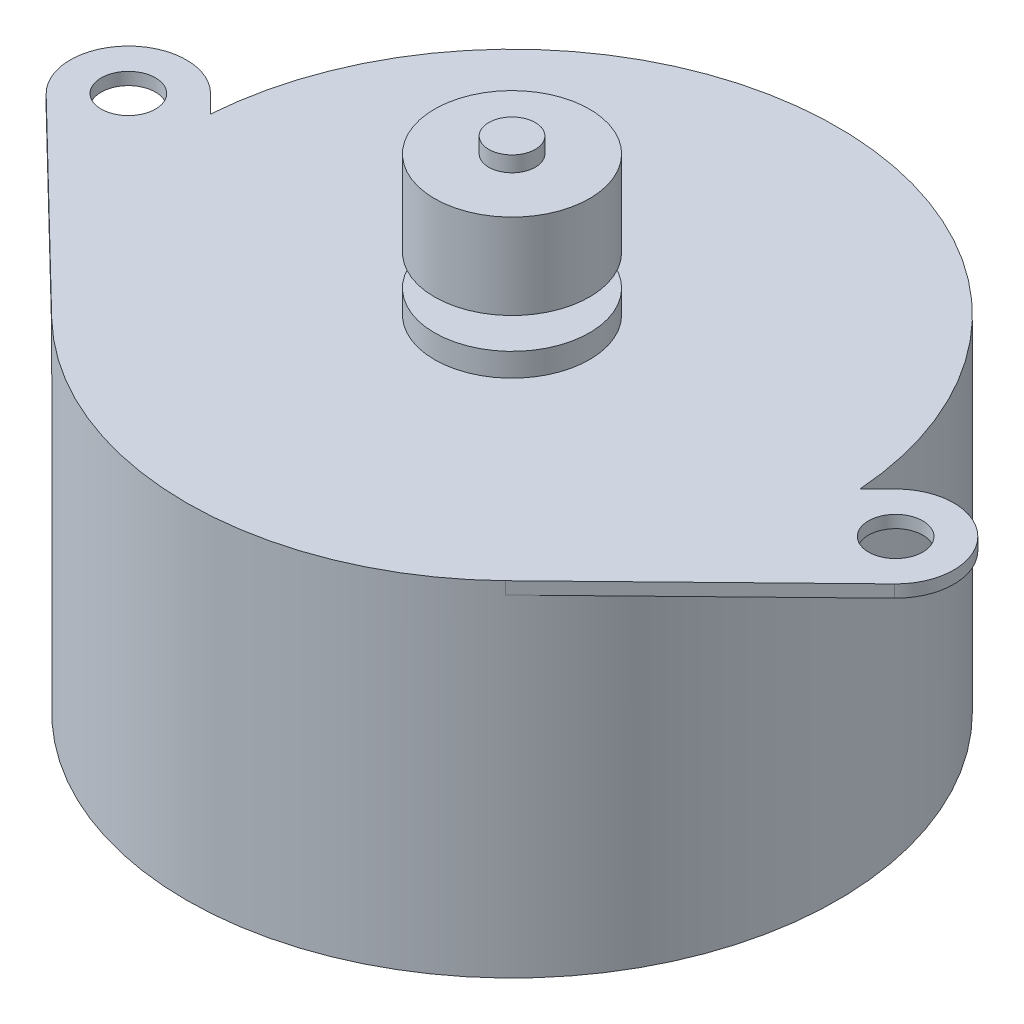
ISO-10303-21;
HEADER;
FILE_DESCRIPTION(('STEP AP214'),'2;1');
FILE_NAME('part.step','',(''),(''),'','','');
FILE_SCHEMA(('AUTOMOTIVE_DESIGN { 1 0 10303 214 1 1 1 1 }'));
ENDSEC;
DATA;
#1=APPLICATION_CONTEXT('core data for automotive mechanical design processes');
#2=APPLICATION_PROTOCOL_DEFINITION('international standard','automotive_design',2000,#1);
#3=PRODUCT_CONTEXT('',#1,'mechanical');
#4=PRODUCT('Part','Part','',(#3));
#5=PRODUCT_RELATED_PRODUCT_CATEGORY('part','',(#4));
#6=PRODUCT_DEFINITION_FORMATION('','',#4);
#7=PRODUCT_DEFINITION_CONTEXT('part definition',#1,'design');
#8=PRODUCT_DEFINITION('design','',#6,#7);
#9=PRODUCT_DEFINITION_SHAPE('','',#8);
#10=(LENGTH_UNIT() NAMED_UNIT(*) SI_UNIT(.MILLI.,.METRE.));
#11=(NAMED_UNIT(*) PLANE_ANGLE_UNIT() SI_UNIT($,.RADIAN.));
#12=(NAMED_UNIT(*) SI_UNIT($,.STERADIAN.) SOLID_ANGLE_UNIT());
#13=UNCERTAINTY_MEASURE_WITH_UNIT(LENGTH_MEASURE(1.E-05),#10,'distance_accuracy_value','');
#14=(GEOMETRIC_REPRESENTATION_CONTEXT(3) GLOBAL_UNCERTAINTY_ASSIGNED_CONTEXT((#13)) GLOBAL_UNIT_ASSIGNED_CONTEXT((#10,
#11,#12)) REPRESENTATION_CONTEXT('',''));
#15=CARTESIAN_POINT('',(0.,0.,0.));
#16=DIRECTION('',(0.,0.,1.));
#17=DIRECTION('',(1.,0.,0.));
#18=AXIS2_PLACEMENT_3D('',#15,#16,#17);
#19=CARTESIAN_POINT('',(0.,32.2,0.));
#20=DIRECTION('',(0.,-1.,0.));
#21=DIRECTION('',(0.,0.,-1.));
#22=AXIS2_PLACEMENT_3D('',#19,#20,#21);
#23=CYLINDRICAL_SURFACE('',#22,1.5);
#24=CARTESIAN_POINT('',(0.,23.7,0.));
#25=DIRECTION('',(0.,1.,0.));
#26=DIRECTION('',(0.,0.,1.));
#27=AXIS2_PLACEMENT_3D('',#24,#25,#26);
#28=CIRCLE('',#27,1.5);
#29=CARTESIAN_POINT('',(0.,23.7,1.5));
#30=VERTEX_POINT('',#29);
#31=EDGE_CURVE('E134',#30,#30,#28,.T.);
#32=ORIENTED_EDGE('',*,*,#31,.T.);
#33=EDGE_LOOP('',(#32));
#34=FACE_BOUND('',#33,.T.);
#35=CARTESIAN_POINT('',(0.,25.7,0.));
#36=DIRECTION('',(0.,1.,0.));
#37=DIRECTION('',(0.,0.,1.));
#38=AXIS2_PLACEMENT_3D('',#35,#36,#37);
#39=CIRCLE('',#38,1.5);
#40=CARTESIAN_POINT('',(0.,25.7,1.5));
#41=VERTEX_POINT('',#40);
#42=EDGE_CURVE('E43',#41,#41,#39,.T.);
#43=ORIENTED_EDGE('',*,*,#42,.F.);
#44=EDGE_LOOP('',(#43));
#45=FACE_BOUND('',#44,.T.);
#46=ADVANCED_FACE('F35',(#34,#45),#23,.T.);
#47=CARTESIAN_POINT('',(0.,21.4,0.));
#48=DIRECTION('',(0.,-1.,0.));
#49=DIRECTION('',(0.,0.,-1.));
#50=AXIS2_PLACEMENT_3D('',#47,#48,#49);
#51=CYLINDRICAL_SURFACE('',#50,21.);
#52=CARTESIAN_POINT('',(0.,21.4,0.));
#53=DIRECTION('',(0.,1.,0.));
#54=DIRECTION('',(0.,0.,1.));
#55=AXIS2_PLACEMENT_3D('',#52,#53,#54);
#56=CIRCLE('',#55,21.);
#57=CARTESIAN_POINT('',(14.6353031626223,21.4,15.0601428060316));
#58=VERTEX_POINT('',#57);
#59=CARTESIAN_POINT('',(20.946382722661,21.4,-1.49968357856137));
#60=VERTEX_POINT('',#59);
#61=EDGE_CURVE('E133',#58,#60,#56,.T.);
#62=ORIENTED_EDGE('',*,*,#61,.F.);
#63=DIRECTION('',(0.,-1.,0.));
#64=VECTOR('',#63,1.);
#65=CARTESIAN_POINT('',(14.6353031626223,22.2,15.0601428060316));
#66=LINE('',#65,#64);
#67=CARTESIAN_POINT('',(14.6353031626223,22.2,15.0601428060316));
#68=VERTEX_POINT('',#67);
#69=EDGE_CURVE('E129',#68,#58,#66,.T.);
#70=ORIENTED_EDGE('',*,*,#69,.F.);
#71=CARTESIAN_POINT('',(0.,22.2,0.));
#72=DIRECTION('',(0.,1.,0.));
#73=DIRECTION('',(0.,0.,1.));
#74=AXIS2_PLACEMENT_3D('',#71,#72,#73);
#75=CIRCLE('',#74,20.9999999999983);
#76=CARTESIAN_POINT('',(-14.6348726808142,22.2,15.0605611321851));
#77=VERTEX_POINT('',#76);
#78=EDGE_CURVE('E109',#77,#68,#75,.T.);
#79=ORIENTED_EDGE('',*,*,#78,.F.);
#80=DIRECTION('',(0.,-1.,0.));
#81=VECTOR('',#80,1.);
#82=CARTESIAN_POINT('',(-14.6348726808142,22.2,15.0605611321851));
#83=LINE('',#82,#81);
#84=CARTESIAN_POINT('',(-14.6348726808142,21.4,15.0605611321851));
#85=VERTEX_POINT('',#84);
#86=EDGE_CURVE('E106',#77,#85,#83,.T.);
#87=ORIENTED_EDGE('',*,*,#86,.T.);
#88=CARTESIAN_POINT('',(-20.9463827224607,21.4,-1.49968358135981));
#89=VERTEX_POINT('',#88);
#90=EDGE_CURVE('E50',#89,#85,#56,.T.);
#91=ORIENTED_EDGE('',*,*,#90,.F.);
#92=DIRECTION('',(0.,-1.,0.));
#93=VECTOR('',#92,1.);
#94=CARTESIAN_POINT('',(-20.9463827224591,22.2,-1.49968358135819));
#95=LINE('',#94,#93);
#96=CARTESIAN_POINT('',(-20.9463827224591,22.2,-1.49968358135819));
#97=VERTEX_POINT('',#96);
#98=EDGE_CURVE('E187',#97,#89,#95,.T.);
#99=ORIENTED_EDGE('',*,*,#98,.F.);
#100=CARTESIAN_POINT('',(0.,22.2,0.));
#101=DIRECTION('',(0.,1.,0.));
#102=DIRECTION('',(0.,0.,1.));
#103=AXIS2_PLACEMENT_3D('',#100,#101,#102);
#104=CIRCLE('',#103,20.9999999999983);
#105=CARTESIAN_POINT('',(20.9463827226594,22.2,-1.49968357855975));
#106=VERTEX_POINT('',#105);
#107=EDGE_CURVE('E171',#106,#97,#104,.T.);
#108=ORIENTED_EDGE('',*,*,#107,.F.);
#109=DIRECTION('',(0.,-1.,0.));
#110=VECTOR('',#109,1.);
#111=CARTESIAN_POINT('',(20.9463827226594,22.2,-1.49968357855975));
#112=LINE('',#111,#110);
#113=EDGE_CURVE('E189',#106,#60,#112,.T.);
#114=ORIENTED_EDGE('',*,*,#113,.T.);
#115=EDGE_LOOP('',(#62,#70,#79,#87,#91,#99,#108,#114));
#116=FACE_BOUND('',#115,.T.);
#117=CARTESIAN_POINT('',(0.,0.,0.));
#118=DIRECTION('',(0.,1.,0.));
#119=DIRECTION('',(0.,0.,1.));
#120=AXIS2_PLACEMENT_3D('',#117,#118,#119);
#121=CIRCLE('',#120,21.);
#122=CARTESIAN_POINT('',(0.,0.,21.));
#123=VERTEX_POINT('',#122);
#124=EDGE_CURVE('E125',#123,#123,#121,.T.);
#125=ORIENTED_EDGE('',*,*,#124,.T.);
#126=EDGE_LOOP('',(#125));
#127=FACE_BOUND('',#126,.T.);
#128=ADVANCED_FACE('F37',(#116,#127),#51,.T.);
#129=CARTESIAN_POINT('',(0.,0.,0.));
#130=DIRECTION('',(0.,1.,0.));
#131=DIRECTION('',(0.,0.,1.));
#132=AXIS2_PLACEMENT_3D('',#129,#130,#131);
#133=PLANE('',#132);
#134=CARTESIAN_POINT('',(0.,0.,0.));
#135=DIRECTION('',(0.,1.,0.));
#136=DIRECTION('',(0.,0.,1.));
#137=AXIS2_PLACEMENT_3D('',#134,#135,#136);
#138=CIRCLE('',#137,1.5);
#139=CARTESIAN_POINT('',(0.,0.,1.5));
#140=VERTEX_POINT('',#139);
#141=EDGE_CURVE('E11',#140,#140,#138,.F.);
#142=ORIENTED_EDGE('',*,*,#141,.F.);
#143=EDGE_LOOP('',(#142));
#144=FACE_BOUND('',#143,.T.);
#145=ORIENTED_EDGE('',*,*,#124,.F.);
#146=EDGE_LOOP('',(#145));
#147=FACE_BOUND('',#146,.T.);
#148=ADVANCED_FACE('F219',(#144,#147),#133,.F.);
#149=CARTESIAN_POINT('',(-24.7499998787075,21.4,0.002450302120806));
#150=DIRECTION('',(0.,1.,0.));
#151=DIRECTION('',(0.,0.,1.));
#152=AXIS2_PLACEMENT_3D('',#149,#150,#151);
#153=PLANE('',#152);
#154=CARTESIAN_POINT('',(24.75,21.4,0.00174279390106055));
#155=DIRECTION('',(0.,1.,0.));
#156=DIRECTION('',(0.,0.,1.));
#157=AXIS2_PLACEMENT_3D('',#154,#155,#156);
#158=CIRCLE('',#157,1.75000000087675);
#159=CARTESIAN_POINT('',(24.75,21.4,1.75174279477781));
#160=VERTEX_POINT('',#159);
#161=EDGE_CURVE('E156',#160,#160,#158,.T.);
#162=ORIENTED_EDGE('',*,*,#161,.T.);
#163=EDGE_LOOP('',(#162));
#164=FACE_BOUND('',#163,.T.);
#165=DIRECTION('',(0.717149657430134,0.,-0.696919198220167));
#166=VECTOR('',#165,1.);
#167=CARTESIAN_POINT('',(27.3634469933236,21.4,2.69105400926601));
#168=LINE('',#167,#166);
#169=CARTESIAN_POINT('',(27.3634469933236,21.4,2.69105400926601));
#170=VERTEX_POINT('',#169);
#171=EDGE_CURVE('E178',#58,#170,#168,.T.);
#172=ORIENTED_EDGE('',*,*,#171,.F.);
#173=ORIENTED_EDGE('',*,*,#61,.T.);
#174=DIRECTION('',(-0.707641402636143,0.,0.706571755220341));
#175=VECTOR('',#174,1.);
#176=CARTESIAN_POINT('',(22.1003559179237,21.4,-2.65191246598448));
#177=LINE('',#176,#175);
#178=CARTESIAN_POINT('',(22.1003559179237,21.4,-2.65191246598448));
#179=VERTEX_POINT('',#178);
#180=EDGE_CURVE('E182',#179,#60,#177,.T.);
#181=ORIENTED_EDGE('',*,*,#180,.F.);
#182=CARTESIAN_POINT('',(24.75,21.4,0.00174279390106055));
#183=DIRECTION('',(0.,1.,0.));
#184=DIRECTION('',(0.,0.,1.));
#185=AXIS2_PLACEMENT_3D('',#182,#183,#184);
#186=CIRCLE('',#185,3.75000000000001);
#187=EDGE_CURVE('E180',#170,#179,#186,.T.);
#188=ORIENTED_EDGE('',*,*,#187,.F.);
#189=EDGE_LOOP('',(#172,#173,#181,#188));
#190=FACE_BOUND('',#189,.T.);
#191=ADVANCED_FACE('F206',(#164,#190),#153,.F.);
#192=CARTESIAN_POINT('',(-24.7499998787075,21.4,0.002450302120806));
#193=DIRECTION('',(0.,1.,0.));
#194=DIRECTION('',(0.,0.,1.));
#195=AXIS2_PLACEMENT_3D('',#192,#193,#194);
#196=CIRCLE('',#195,1.74999999997109);
#197=CARTESIAN_POINT('',(-24.7499998787075,21.4,1.75245030209189));
#198=VERTEX_POINT('',#197);
#199=EDGE_CURVE('E149',#198,#198,#196,.T.);
#200=ORIENTED_EDGE('',*,*,#199,.T.);
#201=EDGE_LOOP('',(#200));
#202=FACE_BOUND('',#201,.T.);
#203=DIRECTION('',(-0.707858252476365,0.,-0.706354510427382));
#204=VECTOR('',#203,1.);
#205=CARTESIAN_POINT('',(-22.1011704646048,21.4,-2.65201814466557));
#206=LINE('',#205,#204);
#207=CARTESIAN_POINT('',(-22.1011704646048,21.4,-2.65201814466557));
#208=VERTEX_POINT('',#207);
#209=EDGE_CURVE('E120',#89,#208,#206,.T.);
#210=ORIENTED_EDGE('',*,*,#209,.F.);
#211=ORIENTED_EDGE('',*,*,#90,.T.);
#212=DIRECTION('',(0.71716957772316,0.,0.696898699086448));
#213=VECTOR('',#212,1.);
#214=CARTESIAN_POINT('',(-27.3633700002817,21.4,2.69183621858266));
#215=LINE('',#214,#213);
#216=CARTESIAN_POINT('',(-27.3633700002817,21.4,2.69183621858266));
#217=VERTEX_POINT('',#216);
#218=EDGE_CURVE('E176',#217,#85,#215,.T.);
#219=ORIENTED_EDGE('',*,*,#218,.F.);
#220=CARTESIAN_POINT('',(-24.7499998787075,21.4,0.002450302120806));
#221=DIRECTION('',(0.,1.,0.));
#222=DIRECTION('',(0.,0.,1.));
#223=AXIS2_PLACEMENT_3D('',#220,#221,#222);
#224=CIRCLE('',#223,3.75000000000001);
#225=EDGE_CURVE('E124',#208,#217,#224,.T.);
#226=ORIENTED_EDGE('',*,*,#225,.F.);
#227=EDGE_LOOP('',(#210,#211,#219,#226));
#228=FACE_BOUND('',#227,.T.);
#229=ADVANCED_FACE('F227',(#202,#228),#153,.F.);
#230=CARTESIAN_POINT('',(-24.7499998787075,22.2,0.002450302120806));
#231=DIRECTION('',(0.,1.,0.));
#232=DIRECTION('',(0.,0.,1.));
#233=AXIS2_PLACEMENT_3D('',#230,#231,#232);
#234=PLANE('',#233);
#235=CARTESIAN_POINT('',(0.,22.2,0.));
#236=DIRECTION('',(0.,1.,0.));
#237=DIRECTION('',(0.,0.,1.));
#238=AXIS2_PLACEMENT_3D('',#235,#236,#237);
#239=CIRCLE('',#238,5.);
#240=CARTESIAN_POINT('',(0.,22.2,5.));
#241=VERTEX_POINT('',#240);
#242=EDGE_CURVE('E150',#241,#241,#239,.T.);
#243=ORIENTED_EDGE('',*,*,#242,.F.);
#244=EDGE_LOOP('',(#243));
#245=FACE_BOUND('',#244,.T.);
#246=CARTESIAN_POINT('',(24.75,22.2,0.00174279390106055));
#247=DIRECTION('',(0.,1.,0.));
#248=DIRECTION('',(0.,0.,1.));
#249=AXIS2_PLACEMENT_3D('',#246,#247,#248);
#250=CIRCLE('',#249,1.75000000087675);
#251=CARTESIAN_POINT('',(24.75,22.2,1.75174279477781));
#252=VERTEX_POINT('',#251);
#253=EDGE_CURVE('E159',#252,#252,#250,.T.);
#254=ORIENTED_EDGE('',*,*,#253,.F.);
#255=EDGE_LOOP('',(#254));
#256=FACE_BOUND('',#255,.T.);
#257=CARTESIAN_POINT('',(-24.7499998787075,22.2,0.002450302120806));
#258=DIRECTION('',(0.,1.,0.));
#259=DIRECTION('',(0.,0.,1.));
#260=AXIS2_PLACEMENT_3D('',#257,#258,#259);
#261=CIRCLE('',#260,3.75000000000001);
#262=CARTESIAN_POINT('',(-22.1011704646048,22.2,-2.65201814466557));
#263=VERTEX_POINT('',#262);
#264=CARTESIAN_POINT('',(-27.3633700002817,22.2,2.69183621858266));
#265=VERTEX_POINT('',#264);
#266=EDGE_CURVE('E110',#263,#265,#261,.T.);
#267=ORIENTED_EDGE('',*,*,#266,.T.);
#268=DIRECTION('',(0.71716957772316,0.,0.696898699086448));
#269=VECTOR('',#268,1.);
#270=CARTESIAN_POINT('',(-27.3633700002817,22.2,2.69183621858266));
#271=LINE('',#270,#269);
#272=EDGE_CURVE('E100',#265,#77,#271,.T.);
#273=ORIENTED_EDGE('',*,*,#272,.T.);
#274=ORIENTED_EDGE('',*,*,#78,.T.);
#275=DIRECTION('',(0.717149657430134,0.,-0.696919198220167));
#276=VECTOR('',#275,1.);
#277=CARTESIAN_POINT('',(27.3634469933236,22.2,2.69105400926601));
#278=LINE('',#277,#276);
#279=CARTESIAN_POINT('',(27.3634469933236,22.2,2.69105400926601));
#280=VERTEX_POINT('',#279);
#281=EDGE_CURVE('E165',#68,#280,#278,.T.);
#282=ORIENTED_EDGE('',*,*,#281,.T.);
#283=CARTESIAN_POINT('',(24.75,22.2,0.00174279390106055));
#284=DIRECTION('',(0.,1.,0.));
#285=DIRECTION('',(0.,0.,1.));
#286=AXIS2_PLACEMENT_3D('',#283,#284,#285);
#287=CIRCLE('',#286,3.75000000000001);
#288=CARTESIAN_POINT('',(22.1003559179237,22.2,-2.65191246598448));
#289=VERTEX_POINT('',#288);
#290=EDGE_CURVE('E167',#280,#289,#287,.T.);
#291=ORIENTED_EDGE('',*,*,#290,.T.);
#292=DIRECTION('',(-0.707641402636143,0.,0.706571755220341));
#293=VECTOR('',#292,1.);
#294=CARTESIAN_POINT('',(22.1003559179237,22.2,-2.65191246598448));
#295=LINE('',#294,#293);
#296=EDGE_CURVE('E169',#289,#106,#295,.T.);
#297=ORIENTED_EDGE('',*,*,#296,.T.);
#298=ORIENTED_EDGE('',*,*,#107,.T.);
#299=DIRECTION('',(-0.707858252476365,0.,-0.706354510427382));
#300=VECTOR('',#299,1.);
#301=CARTESIAN_POINT('',(-22.1011704646048,22.2,-2.65201814466557));
#302=LINE('',#301,#300);
#303=EDGE_CURVE('E116',#97,#263,#302,.T.);
#304=ORIENTED_EDGE('',*,*,#303,.T.);
#305=EDGE_LOOP('',(#267,#273,#274,#282,#291,#297,#298,#304));
#306=FACE_BOUND('',#305,.T.);
#307=CARTESIAN_POINT('',(-24.7499998787075,22.2,0.002450302120806));
#308=DIRECTION('',(0.,1.,0.));
#309=DIRECTION('',(0.,0.,1.));
#310=AXIS2_PLACEMENT_3D('',#307,#308,#309);
#311=CIRCLE('',#310,1.74999999997109);
#312=CARTESIAN_POINT('',(-24.7499998787075,22.2,1.75245030209189));
#313=VERTEX_POINT('',#312);
#314=EDGE_CURVE('E153',#313,#313,#311,.T.);
#315=ORIENTED_EDGE('',*,*,#314,.F.);
#316=EDGE_LOOP('',(#315));
#317=FACE_BOUND('',#316,.T.);
#318=ADVANCED_FACE('F113',(#245,#256,#306,#317),#234,.T.);
#319=CARTESIAN_POINT('',(-24.7499998787075,22.2,0.002450302120806));
#320=DIRECTION('',(0.,-1.,0.));
#321=DIRECTION('',(0.,0.,-1.));
#322=AXIS2_PLACEMENT_3D('',#319,#320,#321);
#323=CYLINDRICAL_SURFACE('',#322,3.75000000000001);
#324=ORIENTED_EDGE('',*,*,#225,.T.);
#325=DIRECTION('',(0.,-1.,0.));
#326=VECTOR('',#325,1.);
#327=CARTESIAN_POINT('',(-27.3633700002817,22.2,2.69183621858266));
#328=LINE('',#327,#326);
#329=EDGE_CURVE('E104',#265,#217,#328,.T.);
#330=ORIENTED_EDGE('',*,*,#329,.F.);
#331=ORIENTED_EDGE('',*,*,#266,.F.);
#332=DIRECTION('',(0.,-1.,0.));
#333=VECTOR('',#332,1.);
#334=CARTESIAN_POINT('',(-22.1011704646048,22.2,-2.65201814466557));
#335=LINE('',#334,#333);
#336=EDGE_CURVE('E174',#263,#208,#335,.T.);
#337=ORIENTED_EDGE('',*,*,#336,.T.);
#338=EDGE_LOOP('',(#324,#330,#331,#337));
#339=FACE_BOUND('',#338,.T.);
#340=ADVANCED_FACE('F122',(#339),#323,.T.);
#341=CARTESIAN_POINT('',(-27.3633700002817,22.2,2.69183621858266));
#342=DIRECTION('',(0.696898699086448,0.,-0.71716957772316));
#343=DIRECTION('',(-0.71716957772316,0.,-0.696898699086448));
#344=AXIS2_PLACEMENT_3D('',#341,#342,#343);
#345=PLANE('',#344);
#346=ORIENTED_EDGE('',*,*,#218,.T.);
#347=ORIENTED_EDGE('',*,*,#86,.F.);
#348=ORIENTED_EDGE('',*,*,#272,.F.);
#349=ORIENTED_EDGE('',*,*,#329,.T.);
#350=EDGE_LOOP('',(#346,#347,#348,#349));
#351=FACE_BOUND('',#350,.T.);
#352=ADVANCED_FACE('F102',(#351),#345,.F.);
#353=CARTESIAN_POINT('',(27.3634469933236,22.2,2.69105400926601));
#354=DIRECTION('',(-0.696919198220167,0.,-0.717149657430135));
#355=DIRECTION('',(-0.717149657430135,0.,0.696919198220167));
#356=AXIS2_PLACEMENT_3D('',#353,#354,#355);
#357=PLANE('',#356);
#358=ORIENTED_EDGE('',*,*,#171,.T.);
#359=DIRECTION('',(0.,-1.,0.));
#360=VECTOR('',#359,1.);
#361=CARTESIAN_POINT('',(27.3634469933236,22.2,2.69105400926601));
#362=LINE('',#361,#360);
#363=EDGE_CURVE('E195',#280,#170,#362,.T.);
#364=ORIENTED_EDGE('',*,*,#363,.F.);
#365=ORIENTED_EDGE('',*,*,#281,.F.);
#366=ORIENTED_EDGE('',*,*,#69,.T.);
#367=EDGE_LOOP('',(#358,#364,#365,#366));
#368=FACE_BOUND('',#367,.T.);
#369=ADVANCED_FACE('F202',(#368),#357,.F.);
#370=CARTESIAN_POINT('',(24.75,22.2,0.00174279390106055));
#371=DIRECTION('',(0.,-1.,0.));
#372=DIRECTION('',(0.,0.,-1.));
#373=AXIS2_PLACEMENT_3D('',#370,#371,#372);
#374=CYLINDRICAL_SURFACE('',#373,3.75000000000001);
#375=ORIENTED_EDGE('',*,*,#187,.T.);
#376=DIRECTION('',(0.,-1.,0.));
#377=VECTOR('',#376,1.);
#378=CARTESIAN_POINT('',(22.1003559179237,22.2,-2.65191246598448));
#379=LINE('',#378,#377);
#380=EDGE_CURVE('E192',#289,#179,#379,.T.);
#381=ORIENTED_EDGE('',*,*,#380,.F.);
#382=ORIENTED_EDGE('',*,*,#290,.F.);
#383=ORIENTED_EDGE('',*,*,#363,.T.);
#384=EDGE_LOOP('',(#375,#381,#382,#383));
#385=FACE_BOUND('',#384,.T.);
#386=ADVANCED_FACE('F210',(#385),#374,.T.);
#387=CARTESIAN_POINT('',(22.1003559179237,22.2,-2.65191246598448));
#388=DIRECTION('',(0.706571755220341,0.,0.707641402636143));
#389=DIRECTION('',(0.707641402636143,0.,-0.706571755220341));
#390=AXIS2_PLACEMENT_3D('',#387,#388,#389);
#391=PLANE('',#390);
#392=ORIENTED_EDGE('',*,*,#180,.T.);
#393=ORIENTED_EDGE('',*,*,#113,.F.);
#394=ORIENTED_EDGE('',*,*,#296,.F.);
#395=ORIENTED_EDGE('',*,*,#380,.T.);
#396=EDGE_LOOP('',(#392,#393,#394,#395));
#397=FACE_BOUND('',#396,.T.);
#398=ADVANCED_FACE('F214',(#397),#391,.F.);
#399=CARTESIAN_POINT('',(-22.1011704646048,22.2,-2.65201814466557));
#400=DIRECTION('',(-0.706354510427382,0.,0.707858252476365));
#401=DIRECTION('',(0.707858252476365,0.,0.706354510427382));
#402=AXIS2_PLACEMENT_3D('',#399,#400,#401);
#403=PLANE('',#402);
#404=ORIENTED_EDGE('',*,*,#209,.T.);
#405=ORIENTED_EDGE('',*,*,#336,.F.);
#406=ORIENTED_EDGE('',*,*,#303,.F.);
#407=ORIENTED_EDGE('',*,*,#98,.T.);
#408=EDGE_LOOP('',(#404,#405,#406,#407));
#409=FACE_BOUND('',#408,.T.);
#410=ADVANCED_FACE('F371',(#409),#403,.F.);
#411=CARTESIAN_POINT('',(24.75,22.2,0.00174279390106055));
#412=DIRECTION('',(0.,-1.,0.));
#413=DIRECTION('',(0.,0.,-1.));
#414=AXIS2_PLACEMENT_3D('',#411,#412,#413);
#415=CYLINDRICAL_SURFACE('',#414,1.75000000087675);
#416=ORIENTED_EDGE('',*,*,#253,.T.);
#417=EDGE_LOOP('',(#416));
#418=FACE_BOUND('',#417,.T.);
#419=ORIENTED_EDGE('',*,*,#161,.F.);
#420=EDGE_LOOP('',(#419));
#421=FACE_BOUND('',#420,.T.);
#422=ADVANCED_FACE('F362',(#418,#421),#415,.F.);
#423=CARTESIAN_POINT('',(-24.7499998787075,22.2,0.002450302120806));
#424=DIRECTION('',(0.,-1.,0.));
#425=DIRECTION('',(0.,0.,-1.));
#426=AXIS2_PLACEMENT_3D('',#423,#424,#425);
#427=CYLINDRICAL_SURFACE('',#426,1.74999999997109);
#428=ORIENTED_EDGE('',*,*,#314,.T.);
#429=EDGE_LOOP('',(#428));
#430=FACE_BOUND('',#429,.T.);
#431=ORIENTED_EDGE('',*,*,#199,.F.);
#432=EDGE_LOOP('',(#431));
#433=FACE_BOUND('',#432,.T.);
#434=ADVANCED_FACE('F352',(#430,#433),#427,.F.);
#435=CARTESIAN_POINT('',(0.,23.7,0.));
#436=DIRECTION('',(0.,-1.,0.));
#437=DIRECTION('',(0.,0.,-1.));
#438=AXIS2_PLACEMENT_3D('',#435,#436,#437);
#439=CYLINDRICAL_SURFACE('',#438,5.);
#440=CARTESIAN_POINT('',(0.,23.7,0.));
#441=DIRECTION('',(0.,1.,0.));
#442=DIRECTION('',(0.,0.,1.));
#443=AXIS2_PLACEMENT_3D('',#440,#441,#442);
#444=CIRCLE('',#443,5.);
#445=CARTESIAN_POINT('',(0.,23.7,5.));
#446=VERTEX_POINT('',#445);
#447=EDGE_CURVE('E146',#446,#446,#444,.T.);
#448=ORIENTED_EDGE('',*,*,#447,.F.);
#449=EDGE_LOOP('',(#448));
#450=FACE_BOUND('',#449,.T.);
#451=ORIENTED_EDGE('',*,*,#242,.T.);
#452=EDGE_LOOP('',(#451));
#453=FACE_BOUND('',#452,.T.);
#454=ADVANCED_FACE('F346',(#450,#453),#439,.T.);
#455=CARTESIAN_POINT('',(0.,23.7,0.));
#456=DIRECTION('',(0.,1.,0.));
#457=DIRECTION('',(0.,0.,1.));
#458=AXIS2_PLACEMENT_3D('',#455,#456,#457);
#459=PLANE('',#458);
#460=ORIENTED_EDGE('',*,*,#31,.F.);
#461=EDGE_LOOP('',(#460));
#462=FACE_BOUND('',#461,.T.);
#463=ORIENTED_EDGE('',*,*,#447,.T.);
#464=EDGE_LOOP('',(#463));
#465=FACE_BOUND('',#464,.T.);
#466=ADVANCED_FACE('F282',(#462,#465),#459,.T.);
#467=CARTESIAN_POINT('',(0.,31.2,0.));
#468=DIRECTION('',(0.,1.,0.));
#469=DIRECTION('',(0.,0.,1.));
#470=AXIS2_PLACEMENT_3D('',#467,#468,#469);
#471=PLANE('',#470);
#472=CARTESIAN_POINT('',(0.,31.2,0.));
#473=DIRECTION('',(0.,1.,0.));
#474=DIRECTION('',(0.,0.,1.));
#475=AXIS2_PLACEMENT_3D('',#472,#473,#474);
#476=CIRCLE('',#475,5.);
#477=CARTESIAN_POINT('',(0.,31.2,5.));
#478=VERTEX_POINT('',#477);
#479=EDGE_CURVE('E259',#478,#478,#476,.T.);
#480=ORIENTED_EDGE('',*,*,#479,.T.);
#481=EDGE_LOOP('',(#480));
#482=FACE_BOUND('',#481,.T.);
#483=CARTESIAN_POINT('',(0.,31.2,0.));
#484=DIRECTION('',(0.,1.,0.));
#485=DIRECTION('',(0.,0.,1.));
#486=AXIS2_PLACEMENT_3D('',#483,#484,#485);
#487=CIRCLE('',#486,1.5);
#488=CARTESIAN_POINT('',(0.,31.2,1.5));
#489=VERTEX_POINT('',#488);
#490=EDGE_CURVE('E256',#489,#489,#487,.T.);
#491=ORIENTED_EDGE('',*,*,#490,.F.);
#492=EDGE_LOOP('',(#491));
#493=FACE_BOUND('',#492,.T.);
#494=ADVANCED_FACE('F278',(#482,#493),#471,.T.);
#495=CARTESIAN_POINT('',(0.,25.7,0.));
#496=DIRECTION('',(0.,1.,0.));
#497=DIRECTION('',(0.,0.,1.));
#498=AXIS2_PLACEMENT_3D('',#495,#496,#497);
#499=PLANE('',#498);
#500=CARTESIAN_POINT('',(0.,25.7,0.));
#501=DIRECTION('',(0.,1.,0.));
#502=DIRECTION('',(0.,0.,1.));
#503=AXIS2_PLACEMENT_3D('',#500,#501,#502);
#504=CIRCLE('',#503,5.);
#505=CARTESIAN_POINT('',(0.,25.7,5.));
#506=VERTEX_POINT('',#505);
#507=EDGE_CURVE('E261',#506,#506,#504,.T.);
#508=ORIENTED_EDGE('',*,*,#507,.F.);
#509=EDGE_LOOP('',(#508));
#510=FACE_BOUND('',#509,.T.);
#511=ORIENTED_EDGE('',*,*,#42,.T.);
#512=EDGE_LOOP('',(#511));
#513=FACE_BOUND('',#512,.T.);
#514=ADVANCED_FACE('F281',(#510,#513),#499,.F.);
#515=CARTESIAN_POINT('',(0.,31.2,0.));
#516=DIRECTION('',(0.,-1.,0.));
#517=DIRECTION('',(0.,0.,-1.));
#518=AXIS2_PLACEMENT_3D('',#515,#516,#517);
#519=CYLINDRICAL_SURFACE('',#518,5.);
#520=ORIENTED_EDGE('',*,*,#479,.F.);
#521=EDGE_LOOP('',(#520));
#522=FACE_BOUND('',#521,.T.);
#523=ORIENTED_EDGE('',*,*,#507,.T.);
#524=EDGE_LOOP('',(#523));
#525=FACE_BOUND('',#524,.T.);
#526=ADVANCED_FACE('F251',(#522,#525),#519,.T.);
#527=CARTESIAN_POINT('',(0.,32.2,0.));
#528=DIRECTION('',(0.,1.,0.));
#529=DIRECTION('',(0.,0.,1.));
#530=AXIS2_PLACEMENT_3D('',#527,#528,#529);
#531=PLANE('',#530);
#532=CARTESIAN_POINT('',(0.,32.2,0.));
#533=DIRECTION('',(0.,1.,0.));
#534=DIRECTION('',(0.,0.,1.));
#535=AXIS2_PLACEMENT_3D('',#532,#533,#534);
#536=CIRCLE('',#535,1.5);
#537=CARTESIAN_POINT('',(0.,32.2,1.5));
#538=VERTEX_POINT('',#537);
#539=EDGE_CURVE('E144',#538,#538,#536,.T.);
#540=ORIENTED_EDGE('',*,*,#539,.T.);
#541=EDGE_LOOP('',(#540));
#542=FACE_BOUND('',#541,.T.);
#543=ADVANCED_FACE('F242',(#542),#531,.T.);
#544=ORIENTED_EDGE('',*,*,#490,.T.);
#545=EDGE_LOOP('',(#544));
#546=FACE_BOUND('',#545,.T.);
#547=ORIENTED_EDGE('',*,*,#539,.F.);
#548=EDGE_LOOP('',(#547));
#549=FACE_BOUND('',#548,.T.);
#550=ADVANCED_FACE('F234',(#546,#549),#23,.T.);
#551=CARTESIAN_POINT('',(0.,-1.,0.));
#552=DIRECTION('',(0.,1.,0.));
#553=DIRECTION('',(0.,0.,1.));
#554=AXIS2_PLACEMENT_3D('',#551,#552,#553);
#555=CYLINDRICAL_SURFACE('',#554,1.5);
#556=CARTESIAN_POINT('',(0.,-1.,0.));
#557=DIRECTION('',(0.,-1.,0.));
#558=DIRECTION('',(0.,0.,-1.));
#559=AXIS2_PLACEMENT_3D('',#556,#557,#558);
#560=CIRCLE('',#559,1.5);
#561=CARTESIAN_POINT('',(0.,-1.,-1.5));
#562=VERTEX_POINT('',#561);
#563=EDGE_CURVE('E268',#562,#562,#560,.T.);
#564=ORIENTED_EDGE('',*,*,#563,.F.);
#565=EDGE_LOOP('',(#564));
#566=FACE_BOUND('',#565,.T.);
#567=ORIENTED_EDGE('',*,*,#141,.T.);
#568=EDGE_LOOP('',(#567));
#569=FACE_BOUND('',#568,.T.);
#570=ADVANCED_FACE('F241',(#566,#569),#555,.T.);
#571=CARTESIAN_POINT('',(0.,-1.,0.));
#572=DIRECTION('',(0.,-1.,0.));
#573=DIRECTION('',(0.,0.,-1.));
#574=AXIS2_PLACEMENT_3D('',#571,#572,#573);
#575=PLANE('',#574);
#576=ORIENTED_EDGE('',*,*,#563,.T.);
#577=EDGE_LOOP('',(#576));
#578=FACE_BOUND('',#577,.T.);
#579=ADVANCED_FACE('F248',(#578),#575,.T.);
#580=CLOSED_SHELL('',(#46,#128,#148,#191,#229,#318,#340,#352,#369,#386,#398,#410,#422,#434,#454,
#466,#494,#514,#526,#543,#550,#570,#579));
#581=MANIFOLD_SOLID_BREP('B2',#580);
#582=ADVANCED_BREP_SHAPE_REPRESENTATION('',(#18,#581),#14);
#583=SHAPE_DEFINITION_REPRESENTATION(#9,#582);
ENDSEC;
END-ISO-10303-21;
